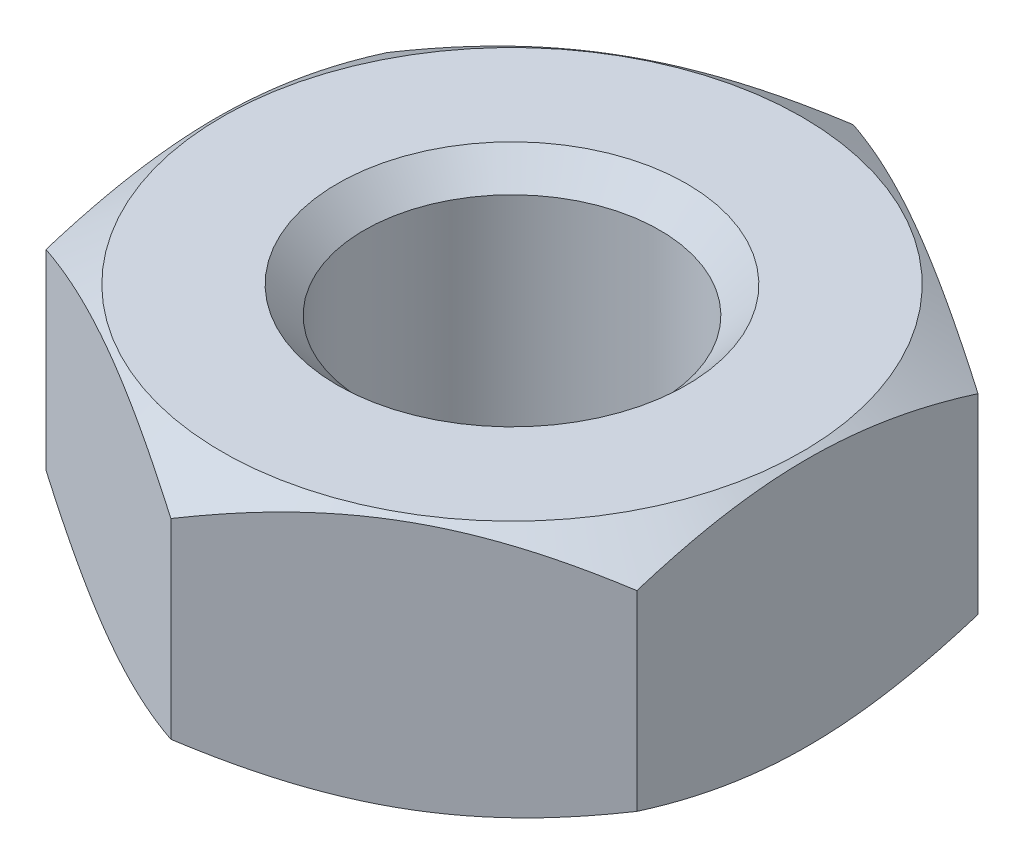
ISO-10303-21;
HEADER;
FILE_DESCRIPTION(('STEP AP214'),'2;1');
FILE_NAME('part.step','',(''),(''),'','','');
FILE_SCHEMA(('AUTOMOTIVE_DESIGN { 1 0 10303 214 1 1 1 1 }'));
ENDSEC;
DATA;
#1=APPLICATION_CONTEXT('core data for automotive mechanical design processes');
#2=APPLICATION_PROTOCOL_DEFINITION('international standard','automotive_design',2000,#1);
#3=PRODUCT_CONTEXT('',#1,'mechanical');
#4=PRODUCT('Part','Part','',(#3));
#5=PRODUCT_RELATED_PRODUCT_CATEGORY('part','',(#4));
#6=PRODUCT_DEFINITION_FORMATION('','',#4);
#7=PRODUCT_DEFINITION_CONTEXT('part definition',#1,'design');
#8=PRODUCT_DEFINITION('design','',#6,#7);
#9=PRODUCT_DEFINITION_SHAPE('','',#8);
#10=(LENGTH_UNIT() NAMED_UNIT(*) SI_UNIT(.MILLI.,.METRE.));
#11=(NAMED_UNIT(*) PLANE_ANGLE_UNIT() SI_UNIT($,.RADIAN.));
#12=(NAMED_UNIT(*) SI_UNIT($,.STERADIAN.) SOLID_ANGLE_UNIT());
#13=UNCERTAINTY_MEASURE_WITH_UNIT(LENGTH_MEASURE(1.E-05),#10,'distance_accuracy_value','');
#14=(GEOMETRIC_REPRESENTATION_CONTEXT(3) GLOBAL_UNCERTAINTY_ASSIGNED_CONTEXT((#13)) GLOBAL_UNIT_ASSIGNED_CONTEXT((#10,
#11,#12)) REPRESENTATION_CONTEXT('',''));
#15=CARTESIAN_POINT('',(0.,0.,0.));
#16=DIRECTION('',(0.,0.,1.));
#17=DIRECTION('',(1.,0.,0.));
#18=AXIS2_PLACEMENT_3D('',#15,#16,#17);
#19=CARTESIAN_POINT('',(0.,-1.19,0.));
#20=DIRECTION('',(0.,1.,0.));
#21=DIRECTION('',(0.,0.,1.));
#22=AXIS2_PLACEMENT_3D('',#19,#20,#21);
#23=PLANE('',#22);
#24=CARTESIAN_POINT('',(0.,-1.19,0.));
#25=DIRECTION('',(0.,1.,0.));
#26=DIRECTION('',(0.,0.,1.));
#27=AXIS2_PLACEMENT_3D('',#24,#25,#26);
#28=CIRCLE('',#27,1.625);
#29=CARTESIAN_POINT('',(0.,-1.19,1.625));
#30=VERTEX_POINT('',#29);
#31=EDGE_CURVE('E258',#30,#30,#28,.T.);
#32=ORIENTED_EDGE('',*,*,#31,.T.);
#33=EDGE_LOOP('',(#32));
#34=FACE_BOUND('',#33,.T.);
#35=CARTESIAN_POINT('',(0.,-1.19,0.));
#36=DIRECTION('',(0.,-1.,0.));
#37=DIRECTION('',(0.,0.,-1.));
#38=AXIS2_PLACEMENT_3D('',#35,#36,#37);
#39=CIRCLE('',#38,2.7);
#40=CARTESIAN_POINT('',(0.,-1.19,-2.7));
#41=VERTEX_POINT('',#40);
#42=EDGE_CURVE('E254',#41,#41,#39,.T.);
#43=ORIENTED_EDGE('',*,*,#42,.T.);
#44=EDGE_LOOP('',(#43));
#45=FACE_BOUND('',#44,.T.);
#46=ADVANCED_FACE('F47',(#34,#45),#23,.F.);
#47=CARTESIAN_POINT('',(0.,1.19,0.));
#48=DIRECTION('',(0.,1.,0.));
#49=DIRECTION('',(0.,0.,1.));
#50=AXIS2_PLACEMENT_3D('',#47,#48,#49);
#51=PLANE('',#50);
#52=CARTESIAN_POINT('',(0.,1.19,0.));
#53=DIRECTION('',(0.,1.,0.));
#54=DIRECTION('',(0.,0.,1.));
#55=AXIS2_PLACEMENT_3D('',#52,#53,#54);
#56=CIRCLE('',#55,1.625);
#57=CARTESIAN_POINT('',(0.,1.19,1.625));
#58=VERTEX_POINT('',#57);
#59=EDGE_CURVE('E11',#58,#58,#56,.F.);
#60=ORIENTED_EDGE('',*,*,#59,.T.);
#61=EDGE_LOOP('',(#60));
#62=FACE_BOUND('',#61,.T.);
#63=CARTESIAN_POINT('',(0.,1.19,0.));
#64=DIRECTION('',(0.,-1.,0.));
#65=DIRECTION('',(0.,0.,-1.));
#66=AXIS2_PLACEMENT_3D('',#63,#64,#65);
#67=CIRCLE('',#66,2.7);
#68=CARTESIAN_POINT('',(0.,1.19,-2.7));
#69=VERTEX_POINT('',#68);
#70=EDGE_CURVE('E119',#69,#69,#67,.T.);
#71=ORIENTED_EDGE('',*,*,#70,.F.);
#72=EDGE_LOOP('',(#71));
#73=FACE_BOUND('',#72,.T.);
#74=ADVANCED_FACE('F285',(#62,#73),#51,.T.);
#75=CARTESIAN_POINT('',(2.75,1.19,-1.58771324027147));
#76=DIRECTION('',(-0.5,0.,0.866025403784439));
#77=DIRECTION('',(0.866025403784439,0.,0.5));
#78=AXIS2_PLACEMENT_3D('',#75,#76,#77);
#79=PLANE('',#78);
#80=DIRECTION('',(0.,-1.,0.));
#81=VECTOR('',#80,1.);
#82=CARTESIAN_POINT('',(2.75,1.19,-1.58771324027147));
#83=LINE('',#82,#81);
#84=CARTESIAN_POINT('',(2.75,0.889999999999999,-1.58771324027147));
#85=VERTEX_POINT('',#84);
#86=CARTESIAN_POINT('',(2.75,-0.89,-1.58771324027147));
#87=VERTEX_POINT('',#86);
#88=EDGE_CURVE('E117',#85,#87,#83,.T.);
#89=ORIENTED_EDGE('',*,*,#88,.T.);
#90=CARTESIAN_POINT('',(2.7502,-0.889927132991092,-1.58759777021763));
#91=CARTESIAN_POINT('',(2.62834203593547,-0.934336751996366,-1.65795249857319));
#92=CARTESIAN_POINT('',(2.50522759205044,-0.974769490917211,-1.72903265589134));
#93=CARTESIAN_POINT('',(2.25643240262327,-1.04529970900199,-1.8726746254802));
#94=CARTESIAN_POINT('',(2.13074508395443,-1.07536592114435,-1.94524023274738));
#95=CARTESIAN_POINT('',(1.88123378763482,-1.12178830950109,-2.08929564684336));
#96=CARTESIAN_POINT('',(1.75746487137287,-1.13852416112537,-2.1607536639645));
#97=CARTESIAN_POINT('',(1.50926700392041,-1.15801158862244,-2.30405076955047));
#98=CARTESIAN_POINT('',(1.38483936721504,-1.16078472078509,-2.37588909909694));
#99=CARTESIAN_POINT('',(1.15489729896343,-1.15275929687787,-2.50864621410004));
#100=CARTESIAN_POINT('',(1.04932680523421,-1.14392106654021,-2.56959736707308));
#101=CARTESIAN_POINT('',(0.839014932298354,-1.11664717385575,-2.69102098352637));
#102=CARTESIAN_POINT('',(0.734274617122881,-1.09820074655756,-2.75149283268794));
#103=CARTESIAN_POINT('',(0.523477565156835,-1.05236446038651,-2.87319656738491));
#104=CARTESIAN_POINT('',(0.417457812679678,-1.02475375774581,-2.93440710001702));
#105=CARTESIAN_POINT('',(0.207273269228891,-0.96234406358364,-3.05575720275783));
#106=CARTESIAN_POINT('',(0.103104665185863,-0.927562330079546,-3.11589897434318));
#107=CARTESIAN_POINT('',(-0.00020000000000008,-0.889927132991093,-3.17554195059678));
#108=B_SPLINE_CURVE_WITH_KNOTS('',3,(#90,#91,#92,#93,#94,#95,#96,#97,#98,#99,#100,#101,#102,
#103,#104,#105,#106,#107),.UNSPECIFIED.,.F.,.F.,(4,2,2,2,2,2,2,2,4),(0.,0.442879830034113,
0.88708400149108,1.3181322392353,1.74851480035265,2.11478013588545,2.48145671784325,
2.85770291968353,3.23305399009867),.UNSPECIFIED.);
#109=CARTESIAN_POINT('',(0.,-0.89,-3.17542648054294));
#110=VERTEX_POINT('',#109);
#111=EDGE_CURVE('E64',#87,#110,#108,.T.);
#112=ORIENTED_EDGE('',*,*,#111,.T.);
#113=DIRECTION('',(0.,-1.,0.));
#114=VECTOR('',#113,1.);
#115=CARTESIAN_POINT('',(0.,1.19,-3.17542648054294));
#116=LINE('',#115,#114);
#117=CARTESIAN_POINT('',(0.,0.89,-3.17542648054294));
#118=VERTEX_POINT('',#117);
#119=EDGE_CURVE('E115',#118,#110,#116,.T.);
#120=ORIENTED_EDGE('',*,*,#119,.F.);
#121=CARTESIAN_POINT('',(-0.000199999999999974,0.889927132991092,-3.17554195059678));
#122=CARTESIAN_POINT('',(0.121657964064524,0.934336751996367,-3.10518722224123));
#123=CARTESIAN_POINT('',(0.244772407949561,0.974769490917212,-3.03410706492307));
#124=CARTESIAN_POINT('',(0.493567597376726,1.04529970900199,-2.89046509533421));
#125=CARTESIAN_POINT('',(0.619254916045568,1.07536592114435,-2.81789948806703));
#126=CARTESIAN_POINT('',(0.868766212365176,1.12178830950109,-2.67384407397106));
#127=CARTESIAN_POINT('',(0.992535128627129,1.13852416112537,-2.60238605684991));
#128=CARTESIAN_POINT('',(1.24073299607959,1.15801158862244,-2.45908895126394));
#129=CARTESIAN_POINT('',(1.36516063278496,1.16078472078509,-2.38725062171747));
#130=CARTESIAN_POINT('',(1.59510270103657,1.15275929687787,-2.25449350671438));
#131=CARTESIAN_POINT('',(1.70067319476579,1.14392106654021,-2.19354235374133));
#132=CARTESIAN_POINT('',(1.91098506770165,1.11664717385575,-2.07211873728804));
#133=CARTESIAN_POINT('',(2.01572538287712,1.09820074655756,-2.01164688812648));
#134=CARTESIAN_POINT('',(2.22652243484316,1.0523644603865,-1.8899431534295));
#135=CARTESIAN_POINT('',(2.33254218732032,1.02475375774581,-1.8287326207974));
#136=CARTESIAN_POINT('',(2.54272673077111,0.96234406358364,-1.70738251805659));
#137=CARTESIAN_POINT('',(2.64689533481414,0.927562330079546,-1.64724074647124));
#138=CARTESIAN_POINT('',(2.7502,0.889927132991093,-1.58759777021763));
#139=B_SPLINE_CURVE_WITH_KNOTS('',3,(#121,#122,#123,#124,#125,#126,#127,#128,#129,#130,#131,
#132,#133,#134,#135,#136,#137,#138),.UNSPECIFIED.,.F.,.F.,(4,2,2,2,2,2,2,2,4),(0.,
0.442879830034113,0.887084001491081,1.3181322392353,1.74851480035265,2.11478013588545,
2.48145671784325,2.85770291968353,3.23305399009867),.UNSPECIFIED.);
#140=EDGE_CURVE('E193',#118,#85,#139,.T.);
#141=ORIENTED_EDGE('',*,*,#140,.T.);
#142=EDGE_LOOP('',(#89,#112,#120,#141));
#143=FACE_BOUND('',#142,.T.);
#144=ADVANCED_FACE('F113',(#143),#79,.F.);
#145=CARTESIAN_POINT('',(0.,1.19,-3.17542648054294));
#146=DIRECTION('',(0.5,0.,0.866025403784439));
#147=DIRECTION('',(0.866025403784439,0.,-0.5));
#148=AXIS2_PLACEMENT_3D('',#145,#146,#147);
#149=PLANE('',#148);
#150=ORIENTED_EDGE('',*,*,#119,.T.);
#151=CARTESIAN_POINT('',(0.000200000000000032,-0.889927132991092,-3.17554195059678));
#152=CARTESIAN_POINT('',(-0.121657964064524,-0.934336751996367,-3.10518722224123));
#153=CARTESIAN_POINT('',(-0.244772407949561,-0.974769490917212,-3.03410706492307));
#154=CARTESIAN_POINT('',(-0.493567597376726,-1.04529970900199,-2.89046509533421));
#155=CARTESIAN_POINT('',(-0.619254916045568,-1.07536592114435,-2.81789948806703));
#156=CARTESIAN_POINT('',(-0.868766212365176,-1.12178830950109,-2.67384407397106));
#157=CARTESIAN_POINT('',(-0.99253512862713,-1.13852416112537,-2.60238605684991));
#158=CARTESIAN_POINT('',(-1.24073299607959,-1.15801158862244,-2.45908895126394));
#159=CARTESIAN_POINT('',(-1.36516063278496,-1.16078472078509,-2.38725062171747));
#160=CARTESIAN_POINT('',(-1.59510270103657,-1.15275929687787,-2.25449350671438));
#161=CARTESIAN_POINT('',(-1.70067319476579,-1.14392106654021,-2.19354235374133));
#162=CARTESIAN_POINT('',(-1.91098506770165,-1.11664717385575,-2.07211873728804));
#163=CARTESIAN_POINT('',(-2.01572538287712,-1.09820074655756,-2.01164688812648));
#164=CARTESIAN_POINT('',(-2.22652243484317,-1.0523644603865,-1.8899431534295));
#165=CARTESIAN_POINT('',(-2.33254218732032,-1.02475375774581,-1.8287326207974));
#166=CARTESIAN_POINT('',(-2.54272673077111,-0.96234406358364,-1.70738251805659));
#167=CARTESIAN_POINT('',(-2.64689533481414,-0.927562330079546,-1.64724074647124));
#168=CARTESIAN_POINT('',(-2.7502,-0.889927132991092,-1.58759777021763));
#169=B_SPLINE_CURVE_WITH_KNOTS('',3,(#151,#152,#153,#154,#155,#156,#157,#158,#159,#160,#161,
#162,#163,#164,#165,#166,#167,#168),.UNSPECIFIED.,.F.,.F.,(4,2,2,2,2,2,2,2,4),(0.,
0.442879830034113,0.887084001491081,1.3181322392353,1.74851480035265,2.11478013588545,
2.48145671784325,2.85770291968353,3.23305399009867),.UNSPECIFIED.);
#170=CARTESIAN_POINT('',(-2.75,-0.889999999999999,-1.58771324027147));
#171=VERTEX_POINT('',#170);
#172=EDGE_CURVE('E100',#110,#171,#169,.T.);
#173=ORIENTED_EDGE('',*,*,#172,.T.);
#174=DIRECTION('',(0.,-1.,0.));
#175=VECTOR('',#174,1.);
#176=CARTESIAN_POINT('',(-2.75,1.19,-1.58771324027147));
#177=LINE('',#176,#175);
#178=CARTESIAN_POINT('',(-2.75,0.889999999999999,-1.58771324027147));
#179=VERTEX_POINT('',#178);
#180=EDGE_CURVE('E126',#179,#171,#177,.T.);
#181=ORIENTED_EDGE('',*,*,#180,.F.);
#182=CARTESIAN_POINT('',(-2.7502,0.889927132991091,-1.58759777021763));
#183=CARTESIAN_POINT('',(-2.62834203593548,0.934336751996366,-1.65795249857319));
#184=CARTESIAN_POINT('',(-2.50522759205044,0.974769490917211,-1.72903265589134));
#185=CARTESIAN_POINT('',(-2.25643240262327,1.04529970900199,-1.8726746254802));
#186=CARTESIAN_POINT('',(-2.13074508395443,1.07536592114435,-1.94524023274738));
#187=CARTESIAN_POINT('',(-1.88123378763482,1.12178830950109,-2.08929564684336));
#188=CARTESIAN_POINT('',(-1.75746487137287,1.13852416112537,-2.1607536639645));
#189=CARTESIAN_POINT('',(-1.50926700392041,1.15801158862244,-2.30405076955048));
#190=CARTESIAN_POINT('',(-1.38483936721505,1.16078472078508,-2.37588909909695));
#191=CARTESIAN_POINT('',(-1.15489729896343,1.15275929687787,-2.50864621410004));
#192=CARTESIAN_POINT('',(-1.04932680523421,1.14392106654021,-2.56959736707308));
#193=CARTESIAN_POINT('',(-0.839014932298354,1.11664717385575,-2.69102098352637));
#194=CARTESIAN_POINT('',(-0.734274617122881,1.09820074655756,-2.75149283268794));
#195=CARTESIAN_POINT('',(-0.523477565156835,1.05236446038651,-2.87319656738491));
#196=CARTESIAN_POINT('',(-0.417457812679678,1.02475375774581,-2.93440710001702));
#197=CARTESIAN_POINT('',(-0.207273269228891,0.96234406358364,-3.05575720275783));
#198=CARTESIAN_POINT('',(-0.103104665185863,0.927562330079546,-3.11589897434318));
#199=CARTESIAN_POINT('',(0.000200000000000113,0.889927132991093,-3.17554195059678));
#200=B_SPLINE_CURVE_WITH_KNOTS('',3,(#182,#183,#184,#185,#186,#187,#188,#189,#190,#191,#192,
#193,#194,#195,#196,#197,#198,#199),.UNSPECIFIED.,.F.,.F.,(4,2,2,2,2,2,2,2,4),(0.,
0.442879830034113,0.887084001491081,1.3181322392353,1.74851480035265,2.11478013588545,
2.48145671784325,2.85770291968353,3.23305399009867),.UNSPECIFIED.);
#201=EDGE_CURVE('E123',#179,#118,#200,.T.);
#202=ORIENTED_EDGE('',*,*,#201,.T.);
#203=EDGE_LOOP('',(#150,#173,#181,#202));
#204=FACE_BOUND('',#203,.T.);
#205=ADVANCED_FACE('F122',(#204),#149,.F.);
#206=CARTESIAN_POINT('',(-2.75,1.19,-1.58771324027147));
#207=DIRECTION('',(1.,0.,0.));
#208=DIRECTION('',(0.,0.,-1.));
#209=AXIS2_PLACEMENT_3D('',#206,#207,#208);
#210=PLANE('',#209);
#211=ORIENTED_EDGE('',*,*,#180,.T.);
#212=CARTESIAN_POINT('',(-2.75,0.584673969459487,-4.77747956397966));
#213=CARTESIAN_POINT('',(-2.75,0.527374138466426,-4.67269151048726));
#214=CARTESIAN_POINT('',(-2.75,0.470424523170804,-4.56771029202685));
#215=CARTESIAN_POINT('',(-2.75,0.357380365826626,-4.35728531984223));
#216=CARTESIAN_POINT('',(-2.75,0.301285845507823,-4.25184155445114));
#217=CARTESIAN_POINT('',(-2.75,0.190025285553225,-4.04026055238447));
#218=CARTESIAN_POINT('',(-2.75,0.134860780159477,-3.93412250751069));
#219=CARTESIAN_POINT('',(-2.75,0.0257541907585108,-3.7212173874075));
#220=CARTESIAN_POINT('',(-2.75,-0.0281878783593429,-3.61445030453631));
#221=CARTESIAN_POINT('',(-2.75,-0.137050199448037,-3.39522327530579));
#222=CARTESIAN_POINT('',(-2.75,-0.191900313662935,-3.28272840844061));
#223=CARTESIAN_POINT('',(-2.75,-0.299594008946224,-3.05678305552543));
#224=CARTESIAN_POINT('',(-2.75,-0.352437641365961,-2.94333259402261));
#225=CARTESIAN_POINT('',(-2.75,-0.455599497642948,-2.71534720880058));
#226=CARTESIAN_POINT('',(-2.75,-0.505918882541288,-2.60081281299924));
#227=CARTESIAN_POINT('',(-2.75,-0.603404454182482,-2.37041565382409));
#228=CARTESIAN_POINT('',(-2.75,-0.650570886659272,-2.25455299479856));
#229=CARTESIAN_POINT('',(-2.75,-0.752291859632296,-1.99191854828311));
#230=CARTESIAN_POINT('',(-2.75,-0.80571960262551,-1.84470424191887));
#231=CARTESIAN_POINT('',(-2.75,-0.904159673064797,-1.54751455732185));
#232=CARTESIAN_POINT('',(-2.75,-0.949175780979939,-1.39754045288706));
#233=CARTESIAN_POINT('',(-2.75,-1.02735759983229,-1.09731583761053));
#234=CARTESIAN_POINT('',(-2.75,-1.06072002789286,-0.947117788142311));
#235=CARTESIAN_POINT('',(-2.75,-1.11381250934769,-0.644319855871531));
#236=CARTESIAN_POINT('',(-2.75,-1.13354830938148,-0.491721013338231));
#237=CARTESIAN_POINT('',(-2.75,-1.15733862976471,-0.182926143555731));
#238=CARTESIAN_POINT('',(-2.75,-1.16115090412153,-0.0267106529685851));
#239=CARTESIAN_POINT('',(-2.75,-1.15191662358181,0.28521421897194));
#240=CARTESIAN_POINT('',(-2.75,-1.13886842160816,0.440923549389455));
#241=CARTESIAN_POINT('',(-2.75,-1.09717454305177,0.753200743279462));
#242=CARTESIAN_POINT('',(-2.75,-1.06823496251674,0.909727946430018));
#243=CARTESIAN_POINT('',(-2.75,-0.997590808759274,1.21984867739445));
#244=CARTESIAN_POINT('',(-2.75,-0.95588144269263,1.37344108066413));
#245=CARTESIAN_POINT('',(-2.75,-0.864442811104486,1.67217020699863));
#246=CARTESIAN_POINT('',(-2.75,-0.815053015983181,1.81741304544929));
#247=CARTESIAN_POINT('',(-2.75,-0.709515093636363,2.10544378471825));
#248=CARTESIAN_POINT('',(-2.75,-0.653364786926267,2.24823087679597));
#249=CARTESIAN_POINT('',(-2.75,-0.535928726473133,2.53194151600986));
#250=CARTESIAN_POINT('',(-2.75,-0.474634421202884,2.672861490282));
#251=CARTESIAN_POINT('',(-2.75,-0.348251127279306,2.95295710651768));
#252=CARTESIAN_POINT('',(-2.75,-0.283162619827393,3.09213296697083));
#253=CARTESIAN_POINT('',(-2.75,-0.153590708662365,3.36179037588536));
#254=CARTESIAN_POINT('',(-2.75,-0.0892560317666771,3.49234372979524));
#255=CARTESIAN_POINT('',(-2.75,0.0414596991611878,3.75242634075449));
#256=CARTESIAN_POINT('',(-2.75,0.107840842220711,3.88195555294179));
#257=CARTESIAN_POINT('',(-2.75,0.241902679649727,4.13955180625084));
#258=CARTESIAN_POINT('',(-2.75,0.309575654980087,4.26762287590992));
#259=CARTESIAN_POINT('',(-2.75,0.446221778674964,4.52304931763649));
#260=CARTESIAN_POINT('',(-2.75,0.515194761553058,4.65040477815483));
#261=CARTESIAN_POINT('',(-2.75,0.584673969459491,4.77747956397965));
#262=B_SPLINE_CURVE_WITH_KNOTS('',3,(#212,#213,#214,#215,#216,#217,#218,#219,#220,#221,#222,
#223,#224,#225,#226,#227,#228,#229,#230,#231,#232,#233,#234,#235,#236,#237,#238,#239,#240,#241,
#242,#243,#244,#245,#246,#247,#248,#249,#250,#251,#252,#253,#254,#255,#256,#257,#258,#259,#260,
#261),.UNSPECIFIED.,.F.,.F.,(4,2,2,2,2,2,2,2,2,2,2,2,2,2,2,2,2,2,2,2,2,2,2,2,4),(0.,
0.358295040459135,0.716599170817476,1.07544575492217,1.4342967074581,1.8097439132112,
2.18518150376003,2.56044479597463,2.93567880684055,3.40531915954271,3.87474792986223,
4.33581890010044,4.7966953079213,5.26455809252004,5.73246658545632,6.20933544491912,
6.68638350597235,7.14640087231468,7.60656694026213,8.06751375887625,8.52840224435461,
8.96501324725149,9.40164327089885,9.83618835229221,10.2706784862912),.UNSPECIFIED.);
#263=CARTESIAN_POINT('',(-2.75,-0.889999999999997,1.58771324027147));
#264=VERTEX_POINT('',#263);
#265=EDGE_CURVE('E103',#171,#264,#262,.T.);
#266=ORIENTED_EDGE('',*,*,#265,.T.);
#267=DIRECTION('',(0.,-1.,0.));
#268=VECTOR('',#267,1.);
#269=CARTESIAN_POINT('',(-2.75,1.19,1.58771324027147));
#270=LINE('',#269,#268);
#271=CARTESIAN_POINT('',(-2.75,0.889999999999997,1.58771324027147));
#272=VERTEX_POINT('',#271);
#273=EDGE_CURVE('E132',#272,#264,#270,.T.);
#274=ORIENTED_EDGE('',*,*,#273,.F.);
#275=CARTESIAN_POINT('',(-2.75,-0.584673969459491,4.77747956397965));
#276=CARTESIAN_POINT('',(-2.75,-0.52737413846643,4.67269151048726));
#277=CARTESIAN_POINT('',(-2.75,-0.470424523170809,4.56771029202685));
#278=CARTESIAN_POINT('',(-2.75,-0.35738036582663,4.35728531984223));
#279=CARTESIAN_POINT('',(-2.75,-0.301285845507826,4.25184155445114));
#280=CARTESIAN_POINT('',(-2.75,-0.19002528555323,4.04026055238447));
#281=CARTESIAN_POINT('',(-2.75,-0.134860780159482,3.93412250751069));
#282=CARTESIAN_POINT('',(-2.75,-0.0257541907585158,3.7212173874075));
#283=CARTESIAN_POINT('',(-2.75,0.0281878783593389,3.61445030453631));
#284=CARTESIAN_POINT('',(-2.75,0.137050199448033,3.3952232753058));
#285=CARTESIAN_POINT('',(-2.75,0.191900313662931,3.28272840844061));
#286=CARTESIAN_POINT('',(-2.75,0.29959400894622,3.05678305552543));
#287=CARTESIAN_POINT('',(-2.75,0.352437641365958,2.94333259402261));
#288=CARTESIAN_POINT('',(-2.75,0.455599497642945,2.71534720880058));
#289=CARTESIAN_POINT('',(-2.75,0.505918882541285,2.60081281299924));
#290=CARTESIAN_POINT('',(-2.75,0.603404454182479,2.37041565382409));
#291=CARTESIAN_POINT('',(-2.75,0.650570886659269,2.25455299479857));
#292=CARTESIAN_POINT('',(-2.75,0.752291859632293,1.99191854828311));
#293=CARTESIAN_POINT('',(-2.75,0.805719602625509,1.84470424191887));
#294=CARTESIAN_POINT('',(-2.75,0.904159673064795,1.54751455732185));
#295=CARTESIAN_POINT('',(-2.75,0.949175780979937,1.39754045288706));
#296=CARTESIAN_POINT('',(-2.75,1.02735759983229,1.09731583761053));
#297=CARTESIAN_POINT('',(-2.75,1.06072002789286,0.947117788142312));
#298=CARTESIAN_POINT('',(-2.75,1.11381250934769,0.644319855871532));
#299=CARTESIAN_POINT('',(-2.75,1.13354830938148,0.491721013338232));
#300=CARTESIAN_POINT('',(-2.75,1.15733862976471,0.182926143555732));
#301=CARTESIAN_POINT('',(-2.75,1.16115090412153,0.0267106529685859));
#302=CARTESIAN_POINT('',(-2.75,1.15191662358181,-0.28521421897194));
#303=CARTESIAN_POINT('',(-2.75,1.13886842160816,-0.440923549389454));
#304=CARTESIAN_POINT('',(-2.75,1.09717454305177,-0.753200743279462));
#305=CARTESIAN_POINT('',(-2.75,1.06823496251674,-0.909727946430018));
#306=CARTESIAN_POINT('',(-2.75,0.997590808759275,-1.21984867739445));
#307=CARTESIAN_POINT('',(-2.75,0.95588144269263,-1.37344108066413));
#308=CARTESIAN_POINT('',(-2.75,0.864442811104487,-1.67217020699863));
#309=CARTESIAN_POINT('',(-2.75,0.815053015983182,-1.81741304544929));
#310=CARTESIAN_POINT('',(-2.75,0.709515093636364,-2.10544378471825));
#311=CARTESIAN_POINT('',(-2.75,0.653364786926269,-2.24823087679597));
#312=CARTESIAN_POINT('',(-2.75,0.535928726473135,-2.53194151600986));
#313=CARTESIAN_POINT('',(-2.75,0.474634421202886,-2.67286149028201));
#314=CARTESIAN_POINT('',(-2.75,0.348251127279308,-2.95295710651769));
#315=CARTESIAN_POINT('',(-2.75,0.283162619827394,-3.09213296697083));
#316=CARTESIAN_POINT('',(-2.75,0.153590708662367,-3.36179037588536));
#317=CARTESIAN_POINT('',(-2.75,0.0892560317666793,-3.49234372979524));
#318=CARTESIAN_POINT('',(-2.75,-0.0414596991611849,-3.75242634075449));
#319=CARTESIAN_POINT('',(-2.75,-0.107840842220708,-3.88195555294179));
#320=CARTESIAN_POINT('',(-2.75,-0.241902679649723,-4.13955180625085));
#321=CARTESIAN_POINT('',(-2.75,-0.309575654980083,-4.26762287590992));
#322=CARTESIAN_POINT('',(-2.75,-0.44622177867496,-4.52304931763649));
#323=CARTESIAN_POINT('',(-2.75,-0.515194761553054,-4.65040477815483));
#324=CARTESIAN_POINT('',(-2.75,-0.584673969459487,-4.77747956397966));
#325=B_SPLINE_CURVE_WITH_KNOTS('',3,(#275,#276,#277,#278,#279,#280,#281,#282,#283,#284,#285,
#286,#287,#288,#289,#290,#291,#292,#293,#294,#295,#296,#297,#298,#299,#300,#301,#302,#303,#304,
#305,#306,#307,#308,#309,#310,#311,#312,#313,#314,#315,#316,#317,#318,#319,#320,#321,#322,#323,
#324),.UNSPECIFIED.,.F.,.F.,(4,2,2,2,2,2,2,2,2,2,2,2,2,2,2,2,2,2,2,2,2,2,2,2,4),(0.,
0.358295040459135,0.716599170817475,1.07544575492217,1.4342967074581,1.8097439132112,
2.18518150376003,2.56044479597463,2.93567880684055,3.40531915954271,3.87474792986223,
4.33581890010044,4.7966953079213,5.26455809252004,5.73246658545632,6.20933544491912,
6.68638350597235,7.14640087231468,7.60656694026213,8.06751375887625,8.52840224435461,
8.96501324725149,9.40164327089885,9.83618835229221,10.2706784862912),.UNSPECIFIED.);
#326=EDGE_CURVE('E180',#272,#179,#325,.T.);
#327=ORIENTED_EDGE('',*,*,#326,.T.);
#328=EDGE_LOOP('',(#211,#266,#274,#327));
#329=FACE_BOUND('',#328,.T.);
#330=ADVANCED_FACE('F202',(#329),#210,.F.);
#331=CARTESIAN_POINT('',(-2.75,1.19,1.58771324027147));
#332=DIRECTION('',(0.5,0.,-0.866025403784438));
#333=DIRECTION('',(-0.866025403784439,0.,-0.5));
#334=AXIS2_PLACEMENT_3D('',#331,#332,#333);
#335=PLANE('',#334);
#336=ORIENTED_EDGE('',*,*,#273,.T.);
#337=CARTESIAN_POINT('',(-2.7502,-0.88992713299109,1.58759777021763));
#338=CARTESIAN_POINT('',(-2.62834203593548,-0.934336751996365,1.65795249857319));
#339=CARTESIAN_POINT('',(-2.50522759205044,-0.97476949091721,1.72903265589134));
#340=CARTESIAN_POINT('',(-2.25643240262327,-1.04529970900199,1.8726746254802));
#341=CARTESIAN_POINT('',(-2.13074508395443,-1.07536592114435,1.94524023274738));
#342=CARTESIAN_POINT('',(-1.88123378763482,-1.12178830950108,2.08929564684336));
#343=CARTESIAN_POINT('',(-1.75746487137287,-1.13852416112537,2.1607536639645));
#344=CARTESIAN_POINT('',(-1.50926700392041,-1.15801158862244,2.30405076955047));
#345=CARTESIAN_POINT('',(-1.38483936721505,-1.16078472078508,2.37588909909694));
#346=CARTESIAN_POINT('',(-1.15489729896343,-1.15275929687787,2.50864621410004));
#347=CARTESIAN_POINT('',(-1.04932680523421,-1.14392106654021,2.56959736707308));
#348=CARTESIAN_POINT('',(-0.839014932298354,-1.11664717385575,2.69102098352637));
#349=CARTESIAN_POINT('',(-0.734274617122881,-1.09820074655756,2.75149283268794));
#350=CARTESIAN_POINT('',(-0.523477565156836,-1.0523644603865,2.87319656738491));
#351=CARTESIAN_POINT('',(-0.417457812679679,-1.02475375774581,2.93440710001702));
#352=CARTESIAN_POINT('',(-0.207273269228892,-0.962344063583638,3.05575720275783));
#353=CARTESIAN_POINT('',(-0.103104665185863,-0.927562330079544,3.11589897434318));
#354=CARTESIAN_POINT('',(0.000199999999999728,-0.88992713299109,3.17554195059678));
#355=B_SPLINE_CURVE_WITH_KNOTS('',3,(#337,#338,#339,#340,#341,#342,#343,#344,#345,#346,#347,
#348,#349,#350,#351,#352,#353,#354),.UNSPECIFIED.,.F.,.F.,(4,2,2,2,2,2,2,2,4),(0.,
0.442879830034112,0.88708400149108,1.3181322392353,1.74851480035265,2.11478013588545,
2.48145671784325,2.85770291968353,3.23305399009867),.UNSPECIFIED.);
#356=CARTESIAN_POINT('',(0.,-0.889999999999996,3.17542648054294));
#357=VERTEX_POINT('',#356);
#358=EDGE_CURVE('E248',#264,#357,#355,.T.);
#359=ORIENTED_EDGE('',*,*,#358,.T.);
#360=DIRECTION('',(0.,-1.,0.));
#361=VECTOR('',#360,1.);
#362=CARTESIAN_POINT('',(0.,1.19,3.17542648054294));
#363=LINE('',#362,#361);
#364=CARTESIAN_POINT('',(0.,0.889999999999996,3.17542648054294));
#365=VERTEX_POINT('',#364);
#366=EDGE_CURVE('E241',#365,#357,#363,.T.);
#367=ORIENTED_EDGE('',*,*,#366,.F.);
#368=CARTESIAN_POINT('',(0.000199999999999557,0.88992713299109,3.17554195059678));
#369=CARTESIAN_POINT('',(-0.121657964064525,0.934336751996364,3.10518722224123));
#370=CARTESIAN_POINT('',(-0.244772407949561,0.974769490917209,3.03410706492307));
#371=CARTESIAN_POINT('',(-0.493567597376726,1.04529970900199,2.89046509533421));
#372=CARTESIAN_POINT('',(-0.619254916045568,1.07536592114435,2.81789948806703));
#373=CARTESIAN_POINT('',(-0.868766212365176,1.12178830950108,2.67384407397106));
#374=CARTESIAN_POINT('',(-0.992535128627129,1.13852416112537,2.60238605684991));
#375=CARTESIAN_POINT('',(-1.24073299607959,1.15801158862244,2.45908895126394));
#376=CARTESIAN_POINT('',(-1.36516063278495,1.16078472078508,2.38725062171747));
#377=CARTESIAN_POINT('',(-1.59510270103657,1.15275929687787,2.25449350671438));
#378=CARTESIAN_POINT('',(-1.70067319476579,1.14392106654021,2.19354235374133));
#379=CARTESIAN_POINT('',(-1.91098506770165,1.11664717385575,2.07211873728804));
#380=CARTESIAN_POINT('',(-2.01572538287712,1.09820074655756,2.01164688812648));
#381=CARTESIAN_POINT('',(-2.22652243484317,1.0523644603865,1.8899431534295));
#382=CARTESIAN_POINT('',(-2.33254218732032,1.02475375774581,1.8287326207974));
#383=CARTESIAN_POINT('',(-2.54272673077111,0.962344063583638,1.70738251805658));
#384=CARTESIAN_POINT('',(-2.64689533481414,0.927562330079544,1.64724074647124));
#385=CARTESIAN_POINT('',(-2.7502,0.889927132991091,1.58759777021763));
#386=B_SPLINE_CURVE_WITH_KNOTS('',3,(#368,#369,#370,#371,#372,#373,#374,#375,#376,#377,#378,
#379,#380,#381,#382,#383,#384,#385),.UNSPECIFIED.,.F.,.F.,(4,2,2,2,2,2,2,2,4),(0.,
0.442879830034113,0.88708400149108,1.3181322392353,1.74851480035265,2.11478013588545,
2.48145671784325,2.85770291968353,3.23305399009867),.UNSPECIFIED.);
#387=EDGE_CURVE('E173',#365,#272,#386,.T.);
#388=ORIENTED_EDGE('',*,*,#387,.T.);
#389=EDGE_LOOP('',(#336,#359,#367,#388));
#390=FACE_BOUND('',#389,.T.);
#391=ADVANCED_FACE('F247',(#390),#335,.F.);
#392=CARTESIAN_POINT('',(0.,1.19,3.17542648054294));
#393=DIRECTION('',(-0.5,0.,-0.866025403784439));
#394=DIRECTION('',(-0.866025403784439,0.,0.5));
#395=AXIS2_PLACEMENT_3D('',#392,#393,#394);
#396=PLANE('',#395);
#397=ORIENTED_EDGE('',*,*,#366,.T.);
#398=CARTESIAN_POINT('',(-0.000200000000000497,-0.88992713299109,3.17554195059678));
#399=CARTESIAN_POINT('',(0.121657964064523,-0.934336751996365,3.10518722224123));
#400=CARTESIAN_POINT('',(0.24477240794956,-0.974769490917209,3.03410706492307));
#401=CARTESIAN_POINT('',(0.493567597376725,-1.04529970900199,2.89046509533421));
#402=CARTESIAN_POINT('',(0.619254916045567,-1.07536592114435,2.81789948806703));
#403=CARTESIAN_POINT('',(0.868766212365175,-1.12178830950108,2.67384407397106));
#404=CARTESIAN_POINT('',(0.992535128627129,-1.13852416112537,2.60238605684991));
#405=CARTESIAN_POINT('',(1.24073299607959,-1.15801158862244,2.45908895126394));
#406=CARTESIAN_POINT('',(1.36516063278495,-1.16078472078508,2.38725062171747));
#407=CARTESIAN_POINT('',(1.59510270103657,-1.15275929687787,2.25449350671438));
#408=CARTESIAN_POINT('',(1.70067319476579,-1.14392106654021,2.19354235374133));
#409=CARTESIAN_POINT('',(1.91098506770165,-1.11664717385575,2.07211873728804));
#410=CARTESIAN_POINT('',(2.01572538287712,-1.09820074655756,2.01164688812648));
#411=CARTESIAN_POINT('',(2.22652243484316,-1.0523644603865,1.8899431534295));
#412=CARTESIAN_POINT('',(2.33254218732032,-1.02475375774581,1.8287326207974));
#413=CARTESIAN_POINT('',(2.54272673077111,-0.962344063583638,1.70738251805659));
#414=CARTESIAN_POINT('',(2.64689533481414,-0.927562330079544,1.64724074647124));
#415=CARTESIAN_POINT('',(2.7502,-0.889927132991091,1.58759777021763));
#416=B_SPLINE_CURVE_WITH_KNOTS('',3,(#398,#399,#400,#401,#402,#403,#404,#405,#406,#407,#408,
#409,#410,#411,#412,#413,#414,#415),.UNSPECIFIED.,.F.,.F.,(4,2,2,2,2,2,2,2,4),(0.,
0.442879830034112,0.88708400149108,1.3181322392353,1.74851480035265,2.11478013588545,
2.48145671784325,2.85770291968353,3.23305399009867),.UNSPECIFIED.);
#417=CARTESIAN_POINT('',(2.75,-0.889999999999997,1.58771324027148));
#418=VERTEX_POINT('',#417);
#419=EDGE_CURVE('E250',#357,#418,#416,.T.);
#420=ORIENTED_EDGE('',*,*,#419,.T.);
#421=DIRECTION('',(0.,-1.,0.));
#422=VECTOR('',#421,1.);
#423=CARTESIAN_POINT('',(2.75,1.19,1.58771324027147));
#424=LINE('',#423,#422);
#425=CARTESIAN_POINT('',(2.75,0.889999999999998,1.58771324027147));
#426=VERTEX_POINT('',#425);
#427=EDGE_CURVE('E238',#426,#418,#424,.T.);
#428=ORIENTED_EDGE('',*,*,#427,.F.);
#429=CARTESIAN_POINT('',(2.7502,0.88992713299109,1.58759777021763));
#430=CARTESIAN_POINT('',(2.62834203593547,0.934336751996365,1.65795249857319));
#431=CARTESIAN_POINT('',(2.50522759205044,0.97476949091721,1.72903265589134));
#432=CARTESIAN_POINT('',(2.25643240262327,1.04529970900199,1.8726746254802));
#433=CARTESIAN_POINT('',(2.13074508395443,1.07536592114435,1.94524023274738));
#434=CARTESIAN_POINT('',(1.88123378763482,1.12178830950108,2.08929564684336));
#435=CARTESIAN_POINT('',(1.75746487137287,1.13852416112537,2.1607536639645));
#436=CARTESIAN_POINT('',(1.50926700392041,1.15801158862244,2.30405076955047));
#437=CARTESIAN_POINT('',(1.38483936721504,1.16078472078508,2.37588909909694));
#438=CARTESIAN_POINT('',(1.15489729896343,1.15275929687787,2.50864621410004));
#439=CARTESIAN_POINT('',(1.04932680523421,1.14392106654021,2.56959736707308));
#440=CARTESIAN_POINT('',(0.839014932298353,1.11664717385575,2.69102098352637));
#441=CARTESIAN_POINT('',(0.73427461712288,1.09820074655756,2.75149283268794));
#442=CARTESIAN_POINT('',(0.523477565156834,1.0523644603865,2.87319656738491));
#443=CARTESIAN_POINT('',(0.417457812679678,1.0247537577458,2.93440710001702));
#444=CARTESIAN_POINT('',(0.20727326922889,0.962344063583637,3.05575720275783));
#445=CARTESIAN_POINT('',(0.103104665185862,0.927562330079543,3.11589897434318));
#446=CARTESIAN_POINT('',(-0.000200000000000925,0.88992713299109,3.17554195059678));
#447=B_SPLINE_CURVE_WITH_KNOTS('',3,(#429,#430,#431,#432,#433,#434,#435,#436,#437,#438,#439,
#440,#441,#442,#443,#444,#445,#446),.UNSPECIFIED.,.F.,.F.,(4,2,2,2,2,2,2,2,4),(0.,
0.442879830034112,0.88708400149108,1.3181322392353,1.74851480035265,2.11478013588545,
2.48145671784325,2.85770291968353,3.23305399009867),.UNSPECIFIED.);
#448=EDGE_CURVE('E72',#426,#365,#447,.T.);
#449=ORIENTED_EDGE('',*,*,#448,.T.);
#450=EDGE_LOOP('',(#397,#420,#428,#449));
#451=FACE_BOUND('',#450,.T.);
#452=ADVANCED_FACE('F252',(#451),#396,.F.);
#453=CARTESIAN_POINT('',(2.75,1.19,1.58771324027147));
#454=DIRECTION('',(-1.,0.,0.));
#455=DIRECTION('',(0.,0.,1.));
#456=AXIS2_PLACEMENT_3D('',#453,#454,#455);
#457=PLANE('',#456);
#458=ORIENTED_EDGE('',*,*,#427,.T.);
#459=CARTESIAN_POINT('',(2.75,0.584673969459493,4.77747956397966));
#460=CARTESIAN_POINT('',(2.75,0.527374138466432,4.67269151048726));
#461=CARTESIAN_POINT('',(2.75,0.47042452317081,4.56771029202685));
#462=CARTESIAN_POINT('',(2.75,0.357380365826632,4.35728531984223));
#463=CARTESIAN_POINT('',(2.75,0.301285845507828,4.25184155445114));
#464=CARTESIAN_POINT('',(2.75,0.19002528555323,4.04026055238448));
#465=CARTESIAN_POINT('',(2.75,0.134860780159482,3.93412250751069));
#466=CARTESIAN_POINT('',(2.75,0.0257541907585156,3.7212173874075));
#467=CARTESIAN_POINT('',(2.75,-0.0281878783593388,3.61445030453631));
#468=CARTESIAN_POINT('',(2.75,-0.137050199448033,3.3952232753058));
#469=CARTESIAN_POINT('',(2.75,-0.191900313662931,3.28272840844062));
#470=CARTESIAN_POINT('',(2.75,-0.29959400894622,3.05678305552543));
#471=CARTESIAN_POINT('',(2.75,-0.352437641365958,2.94333259402261));
#472=CARTESIAN_POINT('',(2.75,-0.455599497642945,2.71534720880058));
#473=CARTESIAN_POINT('',(2.75,-0.505918882541285,2.60081281299924));
#474=CARTESIAN_POINT('',(2.75,-0.603404454182479,2.37041565382409));
#475=CARTESIAN_POINT('',(2.75,-0.650570886659269,2.25455299479857));
#476=CARTESIAN_POINT('',(2.75,-0.752291859632293,1.99191854828311));
#477=CARTESIAN_POINT('',(2.75,-0.805719602625508,1.84470424191887));
#478=CARTESIAN_POINT('',(2.75,-0.904159673064795,1.54751455732185));
#479=CARTESIAN_POINT('',(2.75,-0.949175780979937,1.39754045288707));
#480=CARTESIAN_POINT('',(2.75,-1.02735759983229,1.09731583761053));
#481=CARTESIAN_POINT('',(2.75,-1.06072002789286,0.947117788142314));
#482=CARTESIAN_POINT('',(2.75,-1.11381250934769,0.644319855871534));
#483=CARTESIAN_POINT('',(2.75,-1.13354830938148,0.491721013338234));
#484=CARTESIAN_POINT('',(2.75,-1.15733862976471,0.182926143555734));
#485=CARTESIAN_POINT('',(2.75,-1.16115090412153,0.0267106529685879));
#486=CARTESIAN_POINT('',(2.75,-1.15191662358181,-0.285214218971937));
#487=CARTESIAN_POINT('',(2.75,-1.13886842160816,-0.440923549389452));
#488=CARTESIAN_POINT('',(2.75,-1.09717454305177,-0.75320074327946));
#489=CARTESIAN_POINT('',(2.75,-1.06823496251674,-0.909727946430015));
#490=CARTESIAN_POINT('',(2.75,-0.997590808759277,-1.21984867739445));
#491=CARTESIAN_POINT('',(2.75,-0.955881442692632,-1.37344108066413));
#492=CARTESIAN_POINT('',(2.75,-0.864442811104488,-1.67217020699863));
#493=CARTESIAN_POINT('',(2.75,-0.815053015983183,-1.81741304544929));
#494=CARTESIAN_POINT('',(2.75,-0.709515093636366,-2.10544378471825));
#495=CARTESIAN_POINT('',(2.75,-0.653364786926271,-2.24823087679597));
#496=CARTESIAN_POINT('',(2.75,-0.535928726473136,-2.53194151600986));
#497=CARTESIAN_POINT('',(2.75,-0.474634421202887,-2.672861490282));
#498=CARTESIAN_POINT('',(2.75,-0.348251127279309,-2.95295710651769));
#499=CARTESIAN_POINT('',(2.75,-0.283162619827396,-3.09213296697083));
#500=CARTESIAN_POINT('',(2.75,-0.153590708662369,-3.36179037588536));
#501=CARTESIAN_POINT('',(2.75,-0.089256031766681,-3.49234372979524));
#502=CARTESIAN_POINT('',(2.75,0.0414596991611834,-3.75242634075449));
#503=CARTESIAN_POINT('',(2.75,0.107840842220707,-3.88195555294179));
#504=CARTESIAN_POINT('',(2.75,0.241902679649722,-4.13955180625085));
#505=CARTESIAN_POINT('',(2.75,0.309575654980082,-4.26762287590992));
#506=CARTESIAN_POINT('',(2.75,0.44622177867496,-4.52304931763649));
#507=CARTESIAN_POINT('',(2.75,0.515194761553054,-4.65040477815484));
#508=CARTESIAN_POINT('',(2.75,0.584673969459488,-4.77747956397966));
#509=B_SPLINE_CURVE_WITH_KNOTS('',3,(#459,#460,#461,#462,#463,#464,#465,#466,#467,#468,#469,
#470,#471,#472,#473,#474,#475,#476,#477,#478,#479,#480,#481,#482,#483,#484,#485,#486,#487,#488,
#489,#490,#491,#492,#493,#494,#495,#496,#497,#498,#499,#500,#501,#502,#503,#504,#505,#506,#507,
#508),.UNSPECIFIED.,.F.,.F.,(4,2,2,2,2,2,2,2,2,2,2,2,2,2,2,2,2,2,2,2,2,2,2,2,4),(0.,
0.358295040459136,0.716599170817477,1.07544575492217,1.4342967074581,1.8097439132112,
2.18518150376003,2.56044479597463,2.93567880684055,3.40531915954271,3.87474792986223,
4.33581890010044,4.7966953079213,5.26455809252004,5.73246658545632,6.20933544491912,
6.68638350597236,7.14640087231468,7.60656694026214,8.06751375887626,8.52840224435462,
8.96501324725149,9.40164327089885,9.83618835229222,10.2706784862912),.UNSPECIFIED.);
#510=EDGE_CURVE('E130',#418,#87,#509,.T.);
#511=ORIENTED_EDGE('',*,*,#510,.T.);
#512=ORIENTED_EDGE('',*,*,#88,.F.);
#513=CARTESIAN_POINT('',(2.75,-0.584673969459487,-4.77747956397966));
#514=CARTESIAN_POINT('',(2.75,-0.527374138466426,-4.67269151048726));
#515=CARTESIAN_POINT('',(2.75,-0.470424523170805,-4.56771029202685));
#516=CARTESIAN_POINT('',(2.75,-0.357380365826627,-4.35728531984223));
#517=CARTESIAN_POINT('',(2.75,-0.301285845507823,-4.25184155445114));
#518=CARTESIAN_POINT('',(2.75,-0.190025285553226,-4.04026055238448));
#519=CARTESIAN_POINT('',(2.75,-0.134860780159477,-3.93412250751069));
#520=CARTESIAN_POINT('',(2.75,-0.0257541907585111,-3.7212173874075));
#521=CARTESIAN_POINT('',(2.75,0.0281878783593425,-3.61445030453631));
#522=CARTESIAN_POINT('',(2.75,0.137050199448036,-3.3952232753058));
#523=CARTESIAN_POINT('',(2.75,0.191900313662934,-3.28272840844062));
#524=CARTESIAN_POINT('',(2.75,0.299594008946223,-3.05678305552543));
#525=CARTESIAN_POINT('',(2.75,0.352437641365961,-2.94333259402261));
#526=CARTESIAN_POINT('',(2.75,0.455599497642949,-2.71534720880058));
#527=CARTESIAN_POINT('',(2.75,0.505918882541288,-2.60081281299924));
#528=CARTESIAN_POINT('',(2.75,0.603404454182483,-2.37041565382409));
#529=CARTESIAN_POINT('',(2.75,0.650570886659272,-2.25455299479857));
#530=CARTESIAN_POINT('',(2.75,0.752291859632296,-1.99191854828311));
#531=CARTESIAN_POINT('',(2.75,0.805719602625511,-1.84470424191887));
#532=CARTESIAN_POINT('',(2.75,0.904159673064797,-1.54751455732185));
#533=CARTESIAN_POINT('',(2.75,0.949175780979939,-1.39754045288706));
#534=CARTESIAN_POINT('',(2.75,1.02735759983229,-1.09731583761053));
#535=CARTESIAN_POINT('',(2.75,1.06072002789286,-0.947117788142312));
#536=CARTESIAN_POINT('',(2.75,1.11381250934769,-0.644319855871533));
#537=CARTESIAN_POINT('',(2.75,1.13354830938148,-0.491721013338233));
#538=CARTESIAN_POINT('',(2.75,1.15733862976471,-0.182926143555733));
#539=CARTESIAN_POINT('',(2.75,1.16115090412153,-0.0267106529685868));
#540=CARTESIAN_POINT('',(2.75,1.15191662358181,0.285214218971939));
#541=CARTESIAN_POINT('',(2.75,1.13886842160816,0.440923549389453));
#542=CARTESIAN_POINT('',(2.75,1.09717454305177,0.75320074327946));
#543=CARTESIAN_POINT('',(2.75,1.06823496251674,0.909727946430016));
#544=CARTESIAN_POINT('',(2.75,0.997590808759276,1.21984867739445));
#545=CARTESIAN_POINT('',(2.75,0.955881442692631,1.37344108066413));
#546=CARTESIAN_POINT('',(2.75,0.864442811104487,1.67217020699863));
#547=CARTESIAN_POINT('',(2.75,0.815053015983181,1.81741304544929));
#548=CARTESIAN_POINT('',(2.75,0.709515093636363,2.10544378471825));
#549=CARTESIAN_POINT('',(2.75,0.653364786926268,2.24823087679597));
#550=CARTESIAN_POINT('',(2.75,0.535928726473133,2.53194151600986));
#551=CARTESIAN_POINT('',(2.75,0.474634421202884,2.672861490282));
#552=CARTESIAN_POINT('',(2.75,0.348251127279306,2.95295710651769));
#553=CARTESIAN_POINT('',(2.75,0.283162619827392,3.09213296697083));
#554=CARTESIAN_POINT('',(2.75,0.153590708662365,3.36179037588536));
#555=CARTESIAN_POINT('',(2.75,0.0892560317666766,3.49234372979524));
#556=CARTESIAN_POINT('',(2.75,-0.0414596991611883,3.75242634075449));
#557=CARTESIAN_POINT('',(2.75,-0.107840842220712,3.88195555294179));
#558=CARTESIAN_POINT('',(2.75,-0.241902679649728,4.13955180625085));
#559=CARTESIAN_POINT('',(2.75,-0.309575654980088,4.26762287590992));
#560=CARTESIAN_POINT('',(2.75,-0.446221778674966,4.52304931763649));
#561=CARTESIAN_POINT('',(2.75,-0.51519476155306,4.65040477815484));
#562=CARTESIAN_POINT('',(2.75,-0.584673969459493,4.77747956397966));
#563=B_SPLINE_CURVE_WITH_KNOTS('',3,(#513,#514,#515,#516,#517,#518,#519,#520,#521,#522,#523,
#524,#525,#526,#527,#528,#529,#530,#531,#532,#533,#534,#535,#536,#537,#538,#539,#540,#541,#542,
#543,#544,#545,#546,#547,#548,#549,#550,#551,#552,#553,#554,#555,#556,#557,#558,#559,#560,#561,
#562),.UNSPECIFIED.,.F.,.F.,(4,2,2,2,2,2,2,2,2,2,2,2,2,2,2,2,2,2,2,2,2,2,2,2,4),(0.,
0.358295040459135,0.716599170817476,1.07544575492217,1.4342967074581,1.8097439132112,
2.18518150376003,2.56044479597463,2.93567880684055,3.40531915954271,3.87474792986223,
4.33581890010044,4.7966953079213,5.26455809252004,5.73246658545632,6.20933544491912,
6.68638350597235,7.14640087231468,7.60656694026214,8.06751375887626,8.52840224435462,
8.96501324725149,9.40164327089886,9.83618835229222,10.2706784862912),.UNSPECIFIED.);
#564=EDGE_CURVE('E125',#85,#426,#563,.T.);
#565=ORIENTED_EDGE('',*,*,#564,.T.);
#566=EDGE_LOOP('',(#458,#511,#512,#565));
#567=FACE_BOUND('',#566,.T.);
#568=ADVANCED_FACE('F148',(#567),#457,.F.);
#569=CARTESIAN_POINT('',(0.,1.19,0.));
#570=DIRECTION('',(0.,-1.,0.));
#571=DIRECTION('',(0.,0.,-1.));
#572=AXIS2_PLACEMENT_3D('',#569,#570,#571);
#573=CYLINDRICAL_SURFACE('',#572,1.375);
#574=CARTESIAN_POINT('',(0.,-0.939999999999999,0.));
#575=DIRECTION('',(0.,1.,0.));
#576=DIRECTION('',(0.,0.,1.));
#577=AXIS2_PLACEMENT_3D('',#574,#575,#576);
#578=CIRCLE('',#577,1.375);
#579=CARTESIAN_POINT('',(0.,-0.939999999999999,1.375));
#580=VERTEX_POINT('',#579);
#581=EDGE_CURVE('E57',#580,#580,#578,.F.);
#582=ORIENTED_EDGE('',*,*,#581,.T.);
#583=EDGE_LOOP('',(#582));
#584=FACE_BOUND('',#583,.T.);
#585=CARTESIAN_POINT('',(0.,0.94,0.));
#586=DIRECTION('',(0.,1.,0.));
#587=DIRECTION('',(0.,0.,1.));
#588=AXIS2_PLACEMENT_3D('',#585,#586,#587);
#589=CIRCLE('',#588,1.375);
#590=CARTESIAN_POINT('',(0.,0.94,1.375));
#591=VERTEX_POINT('',#590);
#592=EDGE_CURVE('E261',#591,#591,#589,.T.);
#593=ORIENTED_EDGE('',*,*,#592,.T.);
#594=EDGE_LOOP('',(#593));
#595=FACE_BOUND('',#594,.T.);
#596=ADVANCED_FACE('F156',(#584,#595),#573,.F.);
#597=CARTESIAN_POINT('',(0.,1.19,0.));
#598=DIRECTION('',(0.,-1.,0.));
#599=DIRECTION('',(0.,0.,-1.));
#600=AXIS2_PLACEMENT_3D('',#597,#598,#599);
#601=CONICAL_SURFACE('',#600,2.7,1.00788517291446);
#602=ORIENTED_EDGE('',*,*,#70,.T.);
#603=EDGE_LOOP('',(#602));
#604=FACE_BOUND('',#603,.T.);
#605=ORIENTED_EDGE('',*,*,#201,.F.);
#606=ORIENTED_EDGE('',*,*,#326,.F.);
#607=ORIENTED_EDGE('',*,*,#387,.F.);
#608=ORIENTED_EDGE('',*,*,#448,.F.);
#609=ORIENTED_EDGE('',*,*,#564,.F.);
#610=ORIENTED_EDGE('',*,*,#140,.F.);
#611=EDGE_LOOP('',(#605,#606,#607,#608,#609,#610));
#612=FACE_BOUND('',#611,.T.);
#613=ADVANCED_FACE('F152',(#604,#612),#601,.T.);
#614=CARTESIAN_POINT('',(0.,-1.19,0.));
#615=DIRECTION('',(0.,1.,0.));
#616=DIRECTION('',(0.,0.,-1.));
#617=AXIS2_PLACEMENT_3D('',#614,#615,#616);
#618=CONICAL_SURFACE('',#617,2.7,1.00788517291446);
#619=ORIENTED_EDGE('',*,*,#42,.F.);
#620=EDGE_LOOP('',(#619));
#621=FACE_BOUND('',#620,.T.);
#622=ORIENTED_EDGE('',*,*,#510,.F.);
#623=ORIENTED_EDGE('',*,*,#419,.F.);
#624=ORIENTED_EDGE('',*,*,#358,.F.);
#625=ORIENTED_EDGE('',*,*,#265,.F.);
#626=ORIENTED_EDGE('',*,*,#172,.F.);
#627=ORIENTED_EDGE('',*,*,#111,.F.);
#628=EDGE_LOOP('',(#622,#623,#624,#625,#626,#627));
#629=FACE_BOUND('',#628,.T.);
#630=ADVANCED_FACE('F101',(#621,#629),#618,.T.);
#631=CARTESIAN_POINT('',(0.,-1.19,0.));
#632=DIRECTION('',(0.,-1.,0.));
#633=DIRECTION('',(0.,0.,-1.));
#634=AXIS2_PLACEMENT_3D('',#631,#632,#633);
#635=CONICAL_SURFACE('',#634,1.625,0.785398163397446);
#636=ORIENTED_EDGE('',*,*,#581,.F.);
#637=EDGE_LOOP('',(#636));
#638=FACE_BOUND('',#637,.T.);
#639=ORIENTED_EDGE('',*,*,#31,.F.);
#640=EDGE_LOOP('',(#639));
#641=FACE_BOUND('',#640,.T.);
#642=ADVANCED_FACE('F273',(#638,#641),#635,.F.);
#643=CARTESIAN_POINT('',(0.,0.94,0.));
#644=DIRECTION('',(0.,1.,0.));
#645=DIRECTION('',(0.,0.,1.));
#646=AXIS2_PLACEMENT_3D('',#643,#644,#645);
#647=CONICAL_SURFACE('',#646,1.375,0.785398163397449);
#648=ORIENTED_EDGE('',*,*,#59,.F.);
#649=EDGE_LOOP('',(#648));
#650=FACE_BOUND('',#649,.T.);
#651=ORIENTED_EDGE('',*,*,#592,.F.);
#652=EDGE_LOOP('',(#651));
#653=FACE_BOUND('',#652,.T.);
#654=ADVANCED_FACE('F50',(#650,#653),#647,.F.);
#655=CLOSED_SHELL('',(#46,#74,#144,#205,#330,#391,#452,#568,#596,#613,#630,#642,#654));
#656=MANIFOLD_SOLID_BREP('B2',#655);
#657=ADVANCED_BREP_SHAPE_REPRESENTATION('',(#18,#656),#14);
#658=SHAPE_DEFINITION_REPRESENTATION(#9,#657);
ENDSEC;
END-ISO-10303-21;
